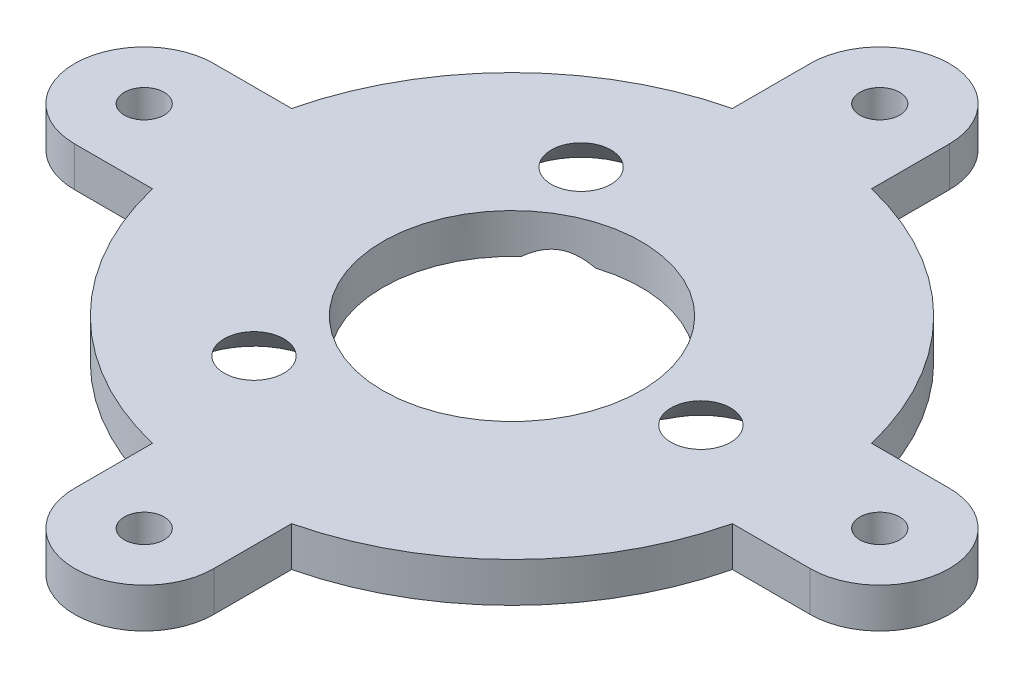
ISO-10303-21;
HEADER;
FILE_DESCRIPTION(('STEP AP214'),'2;1');
FILE_NAME('part.step','',(''),(''),'','','');
FILE_SCHEMA(('AUTOMOTIVE_DESIGN { 1 0 10303 214 1 1 1 1 }'));
ENDSEC;
DATA;
#1=APPLICATION_CONTEXT('core data for automotive mechanical design processes');
#2=APPLICATION_PROTOCOL_DEFINITION('international standard','automotive_design',2000,#1);
#3=PRODUCT_CONTEXT('',#1,'mechanical');
#4=PRODUCT('Part','Part','',(#3));
#5=PRODUCT_RELATED_PRODUCT_CATEGORY('part','',(#4));
#6=PRODUCT_DEFINITION_FORMATION('','',#4);
#7=PRODUCT_DEFINITION_CONTEXT('part definition',#1,'design');
#8=PRODUCT_DEFINITION('design','',#6,#7);
#9=PRODUCT_DEFINITION_SHAPE('','',#8);
#10=(LENGTH_UNIT() NAMED_UNIT(*) SI_UNIT(.MILLI.,.METRE.));
#11=(NAMED_UNIT(*) PLANE_ANGLE_UNIT() SI_UNIT($,.RADIAN.));
#12=(NAMED_UNIT(*) SI_UNIT($,.STERADIAN.) SOLID_ANGLE_UNIT());
#13=UNCERTAINTY_MEASURE_WITH_UNIT(LENGTH_MEASURE(1.E-05),#10,'distance_accuracy_value','');
#14=(GEOMETRIC_REPRESENTATION_CONTEXT(3) GLOBAL_UNCERTAINTY_ASSIGNED_CONTEXT((#13)) GLOBAL_UNIT_ASSIGNED_CONTEXT((#10,
#11,#12)) REPRESENTATION_CONTEXT('',''));
#15=CARTESIAN_POINT('',(0.,0.,0.));
#16=DIRECTION('',(0.,0.,1.));
#17=DIRECTION('',(1.,0.,0.));
#18=AXIS2_PLACEMENT_3D('',#15,#16,#17);
#19=CARTESIAN_POINT('',(0.,2.,0.));
#20=DIRECTION('',(0.,-1.,0.));
#21=DIRECTION('',(0.,0.,-1.));
#22=AXIS2_PLACEMENT_3D('',#19,#20,#21);
#23=CYLINDRICAL_SURFACE('',#22,15.);
#24=DIRECTION('',(0.,-1.,0.));
#25=VECTOR('',#24,1.);
#26=CARTESIAN_POINT('',(3.49999999999882,2.,14.5859521458136));
#27=LINE('',#26,#25);
#28=CARTESIAN_POINT('',(3.49999999999915,2.,14.585952145815));
#29=VERTEX_POINT('',#28);
#30=CARTESIAN_POINT('',(3.49999999999882,0.,14.5859521458136));
#31=VERTEX_POINT('',#30);
#32=EDGE_CURVE('E188',#29,#31,#27,.T.);
#33=ORIENTED_EDGE('',*,*,#32,.T.);
#34=CARTESIAN_POINT('',(0.,0.,0.));
#35=DIRECTION('',(0.,1.,0.));
#36=DIRECTION('',(0.,0.,1.));
#37=AXIS2_PLACEMENT_3D('',#34,#35,#36);
#38=CIRCLE('',#37,15.);
#39=CARTESIAN_POINT('',(14.5859521458148,0.,3.5));
#40=VERTEX_POINT('',#39);
#41=EDGE_CURVE('E381',#31,#40,#38,.T.);
#42=ORIENTED_EDGE('',*,*,#41,.T.);
#43=DIRECTION('',(0.,-1.,0.));
#44=VECTOR('',#43,1.);
#45=CARTESIAN_POINT('',(14.5859521458125,2.,3.5));
#46=LINE('',#45,#44);
#47=CARTESIAN_POINT('',(14.5859521458148,2.,3.5));
#48=VERTEX_POINT('',#47);
#49=EDGE_CURVE('E247',#48,#40,#46,.T.);
#50=ORIENTED_EDGE('',*,*,#49,.F.);
#51=CARTESIAN_POINT('',(0.,2.,0.));
#52=DIRECTION('',(0.,1.,0.));
#53=DIRECTION('',(0.,0.,1.));
#54=AXIS2_PLACEMENT_3D('',#51,#52,#53);
#55=CIRCLE('',#54,15.);
#56=EDGE_CURVE('E65',#29,#48,#55,.T.);
#57=ORIENTED_EDGE('',*,*,#56,.F.);
#58=EDGE_LOOP('',(#33,#42,#50,#57));
#59=FACE_BOUND('',#58,.T.);
#60=ADVANCED_FACE('F41',(#59),#23,.T.);
#61=DIRECTION('',(0.,-1.,0.));
#62=VECTOR('',#61,1.);
#63=CARTESIAN_POINT('',(-3.50000000000118,2.,14.5859521458136));
#64=LINE('',#63,#62);
#65=CARTESIAN_POINT('',(-3.50000000000118,2.,14.5859521458145));
#66=VERTEX_POINT('',#65);
#67=CARTESIAN_POINT('',(-3.50000000000118,0.,14.5859521458145));
#68=VERTEX_POINT('',#67);
#69=EDGE_CURVE('E73',#66,#68,#64,.T.);
#70=ORIENTED_EDGE('',*,*,#69,.F.);
#71=CARTESIAN_POINT('',(-14.5859521458148,2.,3.5));
#72=VERTEX_POINT('',#71);
#73=EDGE_CURVE('E373',#72,#66,#55,.T.);
#74=ORIENTED_EDGE('',*,*,#73,.F.);
#75=DIRECTION('',(0.,-1.,0.));
#76=VECTOR('',#75,1.);
#77=CARTESIAN_POINT('',(-14.5859521458148,2.,3.5));
#78=LINE('',#77,#76);
#79=CARTESIAN_POINT('',(-14.5859521458148,0.,3.5));
#80=VERTEX_POINT('',#79);
#81=EDGE_CURVE('E343',#72,#80,#78,.T.);
#82=ORIENTED_EDGE('',*,*,#81,.T.);
#83=EDGE_CURVE('E378',#80,#68,#38,.T.);
#84=ORIENTED_EDGE('',*,*,#83,.T.);
#85=EDGE_LOOP('',(#70,#74,#82,#84));
#86=FACE_BOUND('',#85,.T.);
#87=ADVANCED_FACE('F444',(#86),#23,.T.);
#88=DIRECTION('',(0.,-1.,0.));
#89=VECTOR('',#88,1.);
#90=CARTESIAN_POINT('',(14.5859521458125,2.,-3.5));
#91=LINE('',#90,#89);
#92=CARTESIAN_POINT('',(14.5859521458147,2.,-3.50000000000054));
#93=VERTEX_POINT('',#92);
#94=CARTESIAN_POINT('',(14.5859521458125,0.,-3.5));
#95=VERTEX_POINT('',#94);
#96=EDGE_CURVE('E251',#93,#95,#91,.T.);
#97=ORIENTED_EDGE('',*,*,#96,.T.);
#98=CARTESIAN_POINT('',(3.49999999999881,0.,-14.5859521458151));
#99=VERTEX_POINT('',#98);
#100=EDGE_CURVE('E481',#95,#99,#38,.T.);
#101=ORIENTED_EDGE('',*,*,#100,.T.);
#102=DIRECTION('',(0.,-1.,0.));
#103=VECTOR('',#102,1.);
#104=CARTESIAN_POINT('',(3.49999999999881,2.,-14.5859521458136));
#105=LINE('',#104,#103);
#106=CARTESIAN_POINT('',(3.49999999999881,2.,-14.5859521458151));
#107=VERTEX_POINT('',#106);
#108=EDGE_CURVE('E293',#107,#99,#105,.T.);
#109=ORIENTED_EDGE('',*,*,#108,.F.);
#110=EDGE_CURVE('E488',#93,#107,#55,.T.);
#111=ORIENTED_EDGE('',*,*,#110,.F.);
#112=EDGE_LOOP('',(#97,#101,#109,#111));
#113=FACE_BOUND('',#112,.T.);
#114=ADVANCED_FACE('F423',(#113),#23,.T.);
#115=DIRECTION('',(0.,-1.,0.));
#116=VECTOR('',#115,1.);
#117=CARTESIAN_POINT('',(-3.50000000000119,2.,-14.5859521458136));
#118=LINE('',#117,#116);
#119=CARTESIAN_POINT('',(-3.50000000000139,2.,-14.5859521458145));
#120=VERTEX_POINT('',#119);
#121=CARTESIAN_POINT('',(-3.50000000000119,0.,-14.5859521458136));
#122=VERTEX_POINT('',#121);
#123=EDGE_CURVE('E297',#120,#122,#118,.T.);
#124=ORIENTED_EDGE('',*,*,#123,.T.);
#125=CARTESIAN_POINT('',(-14.5859521458148,0.,-3.49999999999999));
#126=VERTEX_POINT('',#125);
#127=EDGE_CURVE('E367',#122,#126,#38,.T.);
#128=ORIENTED_EDGE('',*,*,#127,.T.);
#129=DIRECTION('',(0.,-1.,0.));
#130=VECTOR('',#129,1.);
#131=CARTESIAN_POINT('',(-14.5859521458148,2.,-3.49999999999999));
#132=LINE('',#131,#130);
#133=CARTESIAN_POINT('',(-14.5859521458148,2.,-3.5));
#134=VERTEX_POINT('',#133);
#135=EDGE_CURVE('E339',#134,#126,#132,.T.);
#136=ORIENTED_EDGE('',*,*,#135,.F.);
#137=EDGE_CURVE('E377',#120,#134,#55,.T.);
#138=ORIENTED_EDGE('',*,*,#137,.F.);
#139=EDGE_LOOP('',(#124,#128,#136,#138));
#140=FACE_BOUND('',#139,.T.);
#141=ADVANCED_FACE('F417',(#140),#23,.T.);
#142=CARTESIAN_POINT('',(0.,2.,0.));
#143=DIRECTION('',(0.,1.,0.));
#144=DIRECTION('',(0.,0.,1.));
#145=AXIS2_PLACEMENT_3D('',#142,#143,#144);
#146=PLANE('',#145);
#147=CARTESIAN_POINT('',(-4.75000000000004,2.,8.22724133595215));
#148=DIRECTION('',(0.,1.,0.));
#149=DIRECTION('',(0.,0.,1.));
#150=AXIS2_PLACEMENT_3D('',#147,#148,#149);
#151=CIRCLE('',#150,1.5);
#152=CARTESIAN_POINT('',(-4.75000000000004,2.,9.72724133595215));
#153=VERTEX_POINT('',#152);
#154=EDGE_CURVE('E354',#153,#153,#151,.T.);
#155=ORIENTED_EDGE('',*,*,#154,.F.);
#156=EDGE_LOOP('',(#155));
#157=FACE_BOUND('',#156,.T.);
#158=CARTESIAN_POINT('',(0.,2.,0.));
#159=DIRECTION('',(0.,1.,0.));
#160=DIRECTION('',(0.,0.,1.));
#161=AXIS2_PLACEMENT_3D('',#158,#159,#160);
#162=CIRCLE('',#161,6.5);
#163=CARTESIAN_POINT('',(0.,2.,6.5));
#164=VERTEX_POINT('',#163);
#165=EDGE_CURVE('E363',#164,#164,#162,.T.);
#166=ORIENTED_EDGE('',*,*,#165,.F.);
#167=EDGE_LOOP('',(#166));
#168=FACE_BOUND('',#167,.T.);
#169=ORIENTED_EDGE('',*,*,#73,.T.);
#170=DIRECTION('',(0.,0.,1.));
#171=VECTOR('',#170,1.);
#172=CARTESIAN_POINT('',(-3.50000000000118,2.,18.4999999999988));
#173=LINE('',#172,#171);
#174=CARTESIAN_POINT('',(-3.50000000000118,2.,18.4999999999988));
#175=VERTEX_POINT('',#174);
#176=EDGE_CURVE('E191',#66,#175,#173,.T.);
#177=ORIENTED_EDGE('',*,*,#176,.T.);
#178=CARTESIAN_POINT('',(-1.18141773922453E-12,2.,18.4999999999988));
#179=DIRECTION('',(0.,1.,0.));
#180=DIRECTION('',(0.,0.,1.));
#181=AXIS2_PLACEMENT_3D('',#178,#179,#180);
#182=CIRCLE('',#181,3.5);
#183=CARTESIAN_POINT('',(3.49999999999882,2.,18.4999999999988));
#184=VERTEX_POINT('',#183);
#185=EDGE_CURVE('E192',#175,#184,#182,.T.);
#186=ORIENTED_EDGE('',*,*,#185,.T.);
#187=DIRECTION('',(0.,0.,-1.));
#188=VECTOR('',#187,1.);
#189=CARTESIAN_POINT('',(3.49999999999882,2.,18.4999999999988));
#190=LINE('',#189,#188);
#191=EDGE_CURVE('E181',#184,#29,#190,.T.);
#192=ORIENTED_EDGE('',*,*,#191,.T.);
#193=ORIENTED_EDGE('',*,*,#56,.T.);
#194=DIRECTION('',(1.,0.,0.));
#195=VECTOR('',#194,1.);
#196=CARTESIAN_POINT('',(18.4999999999977,2.,3.5));
#197=LINE('',#196,#195);
#198=CARTESIAN_POINT('',(18.4999999999977,2.,3.5));
#199=VERTEX_POINT('',#198);
#200=EDGE_CURVE('E231',#48,#199,#197,.T.);
#201=ORIENTED_EDGE('',*,*,#200,.T.);
#202=CARTESIAN_POINT('',(18.4999999999977,2.,0.));
#203=DIRECTION('',(0.,1.,0.));
#204=DIRECTION('',(0.,0.,1.));
#205=AXIS2_PLACEMENT_3D('',#202,#203,#204);
#206=CIRCLE('',#205,3.5);
#207=CARTESIAN_POINT('',(18.4999999999977,2.,-3.5));
#208=VERTEX_POINT('',#207);
#209=EDGE_CURVE('E222',#199,#208,#206,.T.);
#210=ORIENTED_EDGE('',*,*,#209,.T.);
#211=DIRECTION('',(-1.,0.,0.));
#212=VECTOR('',#211,1.);
#213=CARTESIAN_POINT('',(18.4999999999977,2.,-3.5));
#214=LINE('',#213,#212);
#215=EDGE_CURVE('E226',#208,#93,#214,.T.);
#216=ORIENTED_EDGE('',*,*,#215,.T.);
#217=ORIENTED_EDGE('',*,*,#110,.T.);
#218=DIRECTION('',(0.,0.,-1.));
#219=VECTOR('',#218,1.);
#220=CARTESIAN_POINT('',(3.49999999999881,2.,-18.4999999999988));
#221=LINE('',#220,#219);
#222=CARTESIAN_POINT('',(3.49999999999881,2.,-18.4999999999988));
#223=VERTEX_POINT('',#222);
#224=EDGE_CURVE('E277',#107,#223,#221,.T.);
#225=ORIENTED_EDGE('',*,*,#224,.T.);
#226=CARTESIAN_POINT('',(-1.18594893238137E-12,2.,-18.4999999999988));
#227=DIRECTION('',(0.,1.,0.));
#228=DIRECTION('',(0.,0.,1.));
#229=AXIS2_PLACEMENT_3D('',#226,#227,#228);
#230=CIRCLE('',#229,3.5);
#231=CARTESIAN_POINT('',(-3.50000000000119,2.,-18.4999999999988));
#232=VERTEX_POINT('',#231);
#233=EDGE_CURVE('E268',#223,#232,#230,.T.);
#234=ORIENTED_EDGE('',*,*,#233,.T.);
#235=DIRECTION('',(0.,0.,1.));
#236=VECTOR('',#235,1.);
#237=CARTESIAN_POINT('',(-3.50000000000119,2.,-18.4999999999988));
#238=LINE('',#237,#236);
#239=EDGE_CURVE('E272',#232,#120,#238,.T.);
#240=ORIENTED_EDGE('',*,*,#239,.T.);
#241=ORIENTED_EDGE('',*,*,#137,.T.);
#242=DIRECTION('',(-1.,0.,0.));
#243=VECTOR('',#242,1.);
#244=CARTESIAN_POINT('',(-18.5,2.,-3.5));
#245=LINE('',#244,#243);
#246=CARTESIAN_POINT('',(-18.5,2.,-3.5));
#247=VERTEX_POINT('',#246);
#248=EDGE_CURVE('E323',#134,#247,#245,.T.);
#249=ORIENTED_EDGE('',*,*,#248,.T.);
#250=CARTESIAN_POINT('',(-18.5,2.,0.));
#251=DIRECTION('',(0.,1.,0.));
#252=DIRECTION('',(0.,0.,1.));
#253=AXIS2_PLACEMENT_3D('',#250,#251,#252);
#254=CIRCLE('',#253,3.5);
#255=CARTESIAN_POINT('',(-18.5,2.,3.5));
#256=VERTEX_POINT('',#255);
#257=EDGE_CURVE('E314',#247,#256,#254,.T.);
#258=ORIENTED_EDGE('',*,*,#257,.T.);
#259=DIRECTION('',(1.,0.,0.));
#260=VECTOR('',#259,1.);
#261=CARTESIAN_POINT('',(-18.5,2.,3.5));
#262=LINE('',#261,#260);
#263=EDGE_CURVE('E318',#256,#72,#262,.T.);
#264=ORIENTED_EDGE('',*,*,#263,.T.);
#265=EDGE_LOOP('',(#169,#177,#186,#192,#193,#201,#210,#216,#217,#225,#234,#240,#241,#249,#258,#264));
#266=FACE_BOUND('',#265,.T.);
#267=CARTESIAN_POINT('',(9.5,2.,0.));
#268=DIRECTION('',(0.,1.,0.));
#269=DIRECTION('',(0.,0.,1.));
#270=AXIS2_PLACEMENT_3D('',#267,#268,#269);
#271=CIRCLE('',#270,1.5);
#272=CARTESIAN_POINT('',(9.5,2.,1.5));
#273=VERTEX_POINT('',#272);
#274=EDGE_CURVE('E358',#273,#273,#271,.T.);
#275=ORIENTED_EDGE('',*,*,#274,.F.);
#276=EDGE_LOOP('',(#275));
#277=FACE_BOUND('',#276,.T.);
#278=CARTESIAN_POINT('',(-4.74999999999992,2.,-8.22724133595221));
#279=DIRECTION('',(0.,1.,0.));
#280=DIRECTION('',(0.,0.,1.));
#281=AXIS2_PLACEMENT_3D('',#278,#279,#280);
#282=CIRCLE('',#281,1.5);
#283=CARTESIAN_POINT('',(-4.74999999999992,2.,-6.72724133595221));
#284=VERTEX_POINT('',#283);
#285=EDGE_CURVE('E350',#284,#284,#282,.T.);
#286=ORIENTED_EDGE('',*,*,#285,.F.);
#287=EDGE_LOOP('',(#286));
#288=FACE_BOUND('',#287,.T.);
#289=CARTESIAN_POINT('',(-18.5,2.,0.));
#290=DIRECTION('',(0.,1.,0.));
#291=DIRECTION('',(0.,0.,1.));
#292=AXIS2_PLACEMENT_3D('',#289,#290,#291);
#293=CIRCLE('',#292,1.);
#294=CARTESIAN_POINT('',(-18.5,2.,1.));
#295=VERTEX_POINT('',#294);
#296=EDGE_CURVE('E306',#295,#295,#293,.T.);
#297=ORIENTED_EDGE('',*,*,#296,.F.);
#298=EDGE_LOOP('',(#297));
#299=FACE_BOUND('',#298,.T.);
#300=CARTESIAN_POINT('',(-1.18594893238137E-12,2.,-18.4999999999988));
#301=DIRECTION('',(0.,1.,0.));
#302=DIRECTION('',(0.,0.,1.));
#303=AXIS2_PLACEMENT_3D('',#300,#301,#302);
#304=CIRCLE('',#303,1.);
#305=CARTESIAN_POINT('',(-1.18594893238137E-12,2.,-17.4999999999988));
#306=VERTEX_POINT('',#305);
#307=EDGE_CURVE('E260',#306,#306,#304,.T.);
#308=ORIENTED_EDGE('',*,*,#307,.F.);
#309=EDGE_LOOP('',(#308));
#310=FACE_BOUND('',#309,.T.);
#311=CARTESIAN_POINT('',(18.4999999999977,2.,0.));
#312=DIRECTION('',(0.,1.,0.));
#313=DIRECTION('',(0.,0.,1.));
#314=AXIS2_PLACEMENT_3D('',#311,#312,#313);
#315=CIRCLE('',#314,1.);
#316=CARTESIAN_POINT('',(18.4999999999977,2.,0.999999999999999));
#317=VERTEX_POINT('',#316);
#318=EDGE_CURVE('E213',#317,#317,#315,.T.);
#319=ORIENTED_EDGE('',*,*,#318,.F.);
#320=EDGE_LOOP('',(#319));
#321=FACE_BOUND('',#320,.T.);
#322=CARTESIAN_POINT('',(-1.18141773922453E-12,2.,18.4999999999988));
#323=DIRECTION('',(0.,1.,0.));
#324=DIRECTION('',(0.,0.,1.));
#325=AXIS2_PLACEMENT_3D('',#322,#323,#324);
#326=CIRCLE('',#325,1.);
#327=CARTESIAN_POINT('',(-1.18141773922453E-12,2.,19.4999999999988));
#328=VERTEX_POINT('',#327);
#329=EDGE_CURVE('E454',#328,#328,#326,.T.);
#330=ORIENTED_EDGE('',*,*,#329,.F.);
#331=EDGE_LOOP('',(#330));
#332=FACE_BOUND('',#331,.T.);
#333=ADVANCED_FACE('F195',(#157,#168,#266,#277,#288,#299,#310,#321,#332),#146,.T.);
#334=CARTESIAN_POINT('',(0.,0.,0.));
#335=DIRECTION('',(0.,1.,0.));
#336=DIRECTION('',(0.,0.,1.));
#337=AXIS2_PLACEMENT_3D('',#334,#335,#336);
#338=PLANE('',#337);
#339=ORIENTED_EDGE('',*,*,#83,.F.);
#340=DIRECTION('',(1.,0.,0.));
#341=VECTOR('',#340,1.);
#342=CARTESIAN_POINT('',(-18.5,0.,3.5));
#343=LINE('',#342,#341);
#344=CARTESIAN_POINT('',(-18.5,0.,3.5));
#345=VERTEX_POINT('',#344);
#346=EDGE_CURVE('E330',#345,#80,#343,.T.);
#347=ORIENTED_EDGE('',*,*,#346,.F.);
#348=CARTESIAN_POINT('',(-18.5,0.,0.));
#349=DIRECTION('',(0.,1.,0.));
#350=DIRECTION('',(0.,0.,1.));
#351=AXIS2_PLACEMENT_3D('',#348,#349,#350);
#352=CIRCLE('',#351,3.5);
#353=CARTESIAN_POINT('',(-18.5,0.,-3.5));
#354=VERTEX_POINT('',#353);
#355=EDGE_CURVE('E310',#354,#345,#352,.T.);
#356=ORIENTED_EDGE('',*,*,#355,.F.);
#357=DIRECTION('',(-1.,0.,0.));
#358=VECTOR('',#357,1.);
#359=CARTESIAN_POINT('',(-18.5,0.,-3.5));
#360=LINE('',#359,#358);
#361=EDGE_CURVE('E319',#126,#354,#360,.T.);
#362=ORIENTED_EDGE('',*,*,#361,.F.);
#363=ORIENTED_EDGE('',*,*,#127,.F.);
#364=DIRECTION('',(0.,0.,1.));
#365=VECTOR('',#364,1.);
#366=CARTESIAN_POINT('',(-3.50000000000119,0.,-18.4999999999988));
#367=LINE('',#366,#365);
#368=CARTESIAN_POINT('',(-3.50000000000119,0.,-18.4999999999988));
#369=VERTEX_POINT('',#368);
#370=EDGE_CURVE('E284',#369,#122,#367,.T.);
#371=ORIENTED_EDGE('',*,*,#370,.F.);
#372=CARTESIAN_POINT('',(-1.18594893238137E-12,0.,-18.4999999999988));
#373=DIRECTION('',(0.,1.,0.));
#374=DIRECTION('',(0.,0.,1.));
#375=AXIS2_PLACEMENT_3D('',#372,#373,#374);
#376=CIRCLE('',#375,3.5);
#377=CARTESIAN_POINT('',(3.49999999999881,0.,-18.4999999999988));
#378=VERTEX_POINT('',#377);
#379=EDGE_CURVE('E264',#378,#369,#376,.T.);
#380=ORIENTED_EDGE('',*,*,#379,.F.);
#381=DIRECTION('',(0.,0.,-1.));
#382=VECTOR('',#381,1.);
#383=CARTESIAN_POINT('',(3.49999999999881,0.,-18.4999999999988));
#384=LINE('',#383,#382);
#385=EDGE_CURVE('E273',#99,#378,#384,.T.);
#386=ORIENTED_EDGE('',*,*,#385,.F.);
#387=ORIENTED_EDGE('',*,*,#100,.F.);
#388=DIRECTION('',(-1.,0.,0.));
#389=VECTOR('',#388,1.);
#390=CARTESIAN_POINT('',(18.4999999999977,0.,-3.5));
#391=LINE('',#390,#389);
#392=CARTESIAN_POINT('',(18.4999999999977,0.,-3.5));
#393=VERTEX_POINT('',#392);
#394=EDGE_CURVE('E238',#393,#95,#391,.T.);
#395=ORIENTED_EDGE('',*,*,#394,.F.);
#396=CARTESIAN_POINT('',(18.4999999999977,0.,0.));
#397=DIRECTION('',(0.,1.,0.));
#398=DIRECTION('',(0.,0.,1.));
#399=AXIS2_PLACEMENT_3D('',#396,#397,#398);
#400=CIRCLE('',#399,3.5);
#401=CARTESIAN_POINT('',(18.4999999999977,0.,3.5));
#402=VERTEX_POINT('',#401);
#403=EDGE_CURVE('E220',#402,#393,#400,.T.);
#404=ORIENTED_EDGE('',*,*,#403,.F.);
#405=DIRECTION('',(1.,0.,0.));
#406=VECTOR('',#405,1.);
#407=CARTESIAN_POINT('',(18.4999999999977,0.,3.5));
#408=LINE('',#407,#406);
#409=EDGE_CURVE('E227',#40,#402,#408,.T.);
#410=ORIENTED_EDGE('',*,*,#409,.F.);
#411=ORIENTED_EDGE('',*,*,#41,.F.);
#412=DIRECTION('',(0.,0.,-1.));
#413=VECTOR('',#412,1.);
#414=CARTESIAN_POINT('',(3.49999999999882,0.,18.4999999999988));
#415=LINE('',#414,#413);
#416=CARTESIAN_POINT('',(3.49999999999882,0.,18.4999999999988));
#417=VERTEX_POINT('',#416);
#418=EDGE_CURVE('E448',#417,#31,#415,.T.);
#419=ORIENTED_EDGE('',*,*,#418,.F.);
#420=CARTESIAN_POINT('',(-1.18141773922453E-12,0.,18.4999999999988));
#421=DIRECTION('',(0.,1.,0.));
#422=DIRECTION('',(0.,0.,1.));
#423=AXIS2_PLACEMENT_3D('',#420,#421,#422);
#424=CIRCLE('',#423,3.5);
#425=CARTESIAN_POINT('',(-3.50000000000118,0.,18.4999999999988));
#426=VERTEX_POINT('',#425);
#427=EDGE_CURVE('E206',#426,#417,#424,.T.);
#428=ORIENTED_EDGE('',*,*,#427,.F.);
#429=DIRECTION('',(0.,0.,1.));
#430=VECTOR('',#429,1.);
#431=CARTESIAN_POINT('',(-3.50000000000118,0.,18.4999999999988));
#432=LINE('',#431,#430);
#433=EDGE_CURVE('E202',#68,#426,#432,.T.);
#434=ORIENTED_EDGE('',*,*,#433,.F.);
#435=EDGE_LOOP('',(#339,#347,#356,#362,#363,#371,#380,#386,#387,#395,#404,#410,#411,#419,#428,#434));
#436=FACE_BOUND('',#435,.T.);
#437=CARTESIAN_POINT('',(0.,0.,0.));
#438=DIRECTION('',(0.,1.,0.));
#439=DIRECTION('',(0.,0.,1.));
#440=AXIS2_PLACEMENT_3D('',#437,#438,#439);
#441=CIRCLE('',#440,6.5);
#442=CARTESIAN_POINT('',(-1.99052981844675,0.,6.18771290881165));
#443=VERTEX_POINT('',#442);
#444=CARTESIAN_POINT('',(6.35398147957916,0.,1.37000706464055));
#445=VERTEX_POINT('',#444);
#446=EDGE_CURVE('E362',#443,#445,#441,.T.);
#447=ORIENTED_EDGE('',*,*,#446,.T.);
#448=CARTESIAN_POINT('',(9.5,0.,0.));
#449=DIRECTION('',(0.,1.,0.));
#450=DIRECTION('',(0.,0.,1.));
#451=AXIS2_PLACEMENT_3D('',#448,#449,#450);
#452=CIRCLE('',#451,3.43137754961414);
#453=CARTESIAN_POINT('',(6.35398147957916,0.,-1.37000706464055));
#454=VERTEX_POINT('',#453);
#455=EDGE_CURVE('E389',#445,#454,#452,.T.);
#456=ORIENTED_EDGE('',*,*,#455,.T.);
#457=CARTESIAN_POINT('',(-1.99052981844665,0.,-6.18771290881168));
#458=VERTEX_POINT('',#457);
#459=EDGE_CURVE('E368',#454,#458,#441,.T.);
#460=ORIENTED_EDGE('',*,*,#459,.T.);
#461=CARTESIAN_POINT('',(-4.74999999999992,0.,-8.22724133595221));
#462=DIRECTION('',(0.,1.,0.));
#463=DIRECTION('',(0.,0.,1.));
#464=AXIS2_PLACEMENT_3D('',#461,#462,#463);
#465=CIRCLE('',#464,3.43137754961414);
#466=CARTESIAN_POINT('',(-4.36345166113241,0.,-4.81770584417115));
#467=VERTEX_POINT('',#466);
#468=EDGE_CURVE('E376',#458,#467,#465,.T.);
#469=ORIENTED_EDGE('',*,*,#468,.T.);
#470=CARTESIAN_POINT('',(-4.36345166113247,0.,4.8177058441711));
#471=VERTEX_POINT('',#470);
#472=EDGE_CURVE('E372',#467,#471,#441,.T.);
#473=ORIENTED_EDGE('',*,*,#472,.T.);
#474=CARTESIAN_POINT('',(-4.75000000000004,0.,8.22724133595215));
#475=DIRECTION('',(0.,1.,0.));
#476=DIRECTION('',(0.,0.,1.));
#477=AXIS2_PLACEMENT_3D('',#474,#475,#476);
#478=CIRCLE('',#477,3.43137754961414);
#479=EDGE_CURVE('E385',#471,#443,#478,.T.);
#480=ORIENTED_EDGE('',*,*,#479,.T.);
#481=EDGE_LOOP('',(#447,#456,#460,#469,#473,#480));
#482=FACE_BOUND('',#481,.T.);
#483=CARTESIAN_POINT('',(-18.5,0.,0.));
#484=DIRECTION('',(0.,1.,0.));
#485=DIRECTION('',(0.,0.,1.));
#486=AXIS2_PLACEMENT_3D('',#483,#484,#485);
#487=CIRCLE('',#486,1.);
#488=CARTESIAN_POINT('',(-18.5,0.,1.));
#489=VERTEX_POINT('',#488);
#490=EDGE_CURVE('E305',#489,#489,#487,.T.);
#491=ORIENTED_EDGE('',*,*,#490,.T.);
#492=EDGE_LOOP('',(#491));
#493=FACE_BOUND('',#492,.T.);
#494=CARTESIAN_POINT('',(-1.18594893238137E-12,0.,-18.4999999999988));
#495=DIRECTION('',(0.,1.,0.));
#496=DIRECTION('',(0.,0.,1.));
#497=AXIS2_PLACEMENT_3D('',#494,#495,#496);
#498=CIRCLE('',#497,1.);
#499=CARTESIAN_POINT('',(-1.18594893238137E-12,0.,-17.4999999999988));
#500=VERTEX_POINT('',#499);
#501=EDGE_CURVE('E259',#500,#500,#498,.T.);
#502=ORIENTED_EDGE('',*,*,#501,.T.);
#503=EDGE_LOOP('',(#502));
#504=FACE_BOUND('',#503,.T.);
#505=CARTESIAN_POINT('',(18.4999999999977,0.,0.));
#506=DIRECTION('',(0.,1.,0.));
#507=DIRECTION('',(0.,0.,1.));
#508=AXIS2_PLACEMENT_3D('',#505,#506,#507);
#509=CIRCLE('',#508,1.);
#510=CARTESIAN_POINT('',(18.4999999999977,0.,0.999999999999999));
#511=VERTEX_POINT('',#510);
#512=EDGE_CURVE('E208',#511,#511,#509,.T.);
#513=ORIENTED_EDGE('',*,*,#512,.T.);
#514=EDGE_LOOP('',(#513));
#515=FACE_BOUND('',#514,.T.);
#516=CARTESIAN_POINT('',(-1.18141773922453E-12,0.,18.4999999999988));
#517=DIRECTION('',(0.,1.,0.));
#518=DIRECTION('',(0.,0.,1.));
#519=AXIS2_PLACEMENT_3D('',#516,#517,#518);
#520=CIRCLE('',#519,1.);
#521=CARTESIAN_POINT('',(-1.18141773922453E-12,0.,19.4999999999988));
#522=VERTEX_POINT('',#521);
#523=EDGE_CURVE('E513',#522,#522,#520,.T.);
#524=ORIENTED_EDGE('',*,*,#523,.T.);
#525=EDGE_LOOP('',(#524));
#526=FACE_BOUND('',#525,.T.);
#527=ADVANCED_FACE('F409',(#436,#482,#493,#504,#515,#526),#338,.F.);
#528=CARTESIAN_POINT('',(0.,2.,0.));
#529=DIRECTION('',(0.,-1.,0.));
#530=DIRECTION('',(0.,0.,-1.));
#531=AXIS2_PLACEMENT_3D('',#528,#529,#530);
#532=CYLINDRICAL_SURFACE('',#531,6.5);
#533=ORIENTED_EDGE('',*,*,#165,.T.);
#534=EDGE_LOOP('',(#533));
#535=FACE_BOUND('',#534,.T.);
#536=ORIENTED_EDGE('',*,*,#459,.F.);
#537=CARTESIAN_POINT('',(6.35398147957916,0.,-1.37000706464055));
#538=CARTESIAN_POINT('',(6.36933277695899,0.0439905733202852,-1.29877678597558));
#539=CARTESIAN_POINT('',(6.38375179969553,0.0861673998208572,-1.22611798559287));
#540=CARTESIAN_POINT('',(6.41053166318999,0.165773816872423,-1.07742516951851));
#541=CARTESIAN_POINT('',(6.42288206704704,0.20317912014279,-1.0013763530195));
#542=CARTESIAN_POINT('',(6.44527943488262,0.2719850648157,-0.845355845341482));
#543=CARTESIAN_POINT('',(6.45530382164283,0.303326397442257,-0.765354162805089));
#544=CARTESIAN_POINT('',(6.47255014470055,0.357843258852706,-0.602341643896573));
#545=CARTESIAN_POINT('',(6.47977368859836,0.381023471171434,-0.51933256368911));
#546=CARTESIAN_POINT('',(6.4927637424562,0.422970728528152,-0.32558569628593));
#547=CARTESIAN_POINT('',(6.49744535058935,0.438334967035942,-0.213991251155706));
#548=CARTESIAN_POINT('',(6.50094685074658,0.449804077632399,0.00953862040834799));
#549=CARTESIAN_POINT('',(6.49980674685576,0.44604038874273,0.121466451913322));
#550=CARTESIAN_POINT('',(6.49190948453391,0.420263817955133,0.342547872383482));
#551=CARTESIAN_POINT('',(6.48516934201585,0.398306219435174,0.451708834401524));
#552=CARTESIAN_POINT('',(6.46669524981636,0.339213852089589,0.665969295772846));
#553=CARTESIAN_POINT('',(6.4549308255903,0.301986520855526,0.77103966906551));
#554=CARTESIAN_POINT('',(6.4292553120726,0.222591793209186,0.960426832884736));
#555=CARTESIAN_POINT('',(6.41592541714601,0.181987402329585,1.04550294230978));
#556=CARTESIAN_POINT('',(6.38674835985652,0.0949379985065357,1.21094248388239));
#557=CARTESIAN_POINT('',(6.37093113901175,0.0485636761880788,1.29134810177757));
#558=CARTESIAN_POINT('',(6.35398147957916,0.,1.37000706464055));
#559=B_SPLINE_CURVE_WITH_KNOTS('',3,(#537,#538,#539,#540,#541,#542,#543,#544,#545,#546,#547,
#548,#549,#550,#551,#552,#553,#554,#555,#556,#557,#558),.UNSPECIFIED.,.F.,.F.,(4,2,2,2,2,2,2,2,
2,2,4),(0.,0.255443683969308,0.512139693329113,0.771231794349266,1.03017496330815,
1.36669696872574,1.70090967700549,2.03411056638772,2.36936183265089,2.65465121331866,
2.93673765183547),.UNSPECIFIED.);
#560=EDGE_CURVE('E11',#454,#445,#559,.T.);
#561=ORIENTED_EDGE('',*,*,#560,.T.);
#562=ORIENTED_EDGE('',*,*,#446,.F.);
#563=CARTESIAN_POINT('',(-1.99052981844675,0.,6.18771290881165));
#564=CARTESIAN_POINT('',(-2.05989269797917,0.0439905733202861,6.16539238299115));
#565=CARTESIAN_POINT('',(-2.13002657628737,0.0861673998208584,6.14155022278739));
#566=CARTESIAN_POINT('',(-2.27218826411524,0.165773816872424,6.09039585684628));
#567=CARTESIAN_POINT('',(-2.34422367305965,0.203179120142791,6.06306721208398));
#568=CARTESIAN_POINT('',(-2.49054008013795,0.2719850648157,6.00445364776848));
#569=CARTESIAN_POINT('',(-2.56483576294007,0.303326397442256,5.97313418009199));
#570=CARTESIAN_POINT('',(-2.7146319069786,0.357843258852704,5.90656367452759));
#571=CARTESIAN_POINT('',(-2.79013165113194,0.381023471171432,5.87131490694472));
#572=CARTESIAN_POINT('',(-2.96441638713567,0.42297072852815,5.78569118988055));
#573=CARTESIAN_POINT('',(-3.06340081560625,0.438334967035941,5.7339483588893));
#574=CARTESIAN_POINT('',(-3.25873411296401,0.449804077632397,5.62521581119479));
#575=CARTESIAN_POINT('',(-3.35509640649241,0.446040388742728,5.56826453650989));
#576=CARTESIAN_POINT('',(-3.54260990176339,0.420263817955129,5.45088459648374));
#577=CARTESIAN_POINT('',(-3.63377599671353,0.39830621943517,5.39046698082896));
#578=CARTESIAN_POINT('',(-3.81009395318793,0.339213852089586,5.26733771698668));
#579=CARTESIAN_POINT('',(-3.89520535353146,0.301986520855522,5.20461424009968));
#580=CARTESIAN_POINT('',(-4.04638169179074,0.222591793209183,5.08768501122853));
#581=CARTESIAN_POINT('',(-4.11339481634467,0.181987402329582,5.03360292887981));
#582=CARTESIAN_POINT('',(-4.24208113349225,0.0949379985065339,4.92561508527313));
#583=CARTESIAN_POINT('',(-4.30380583077408,0.0485636761880778,4.87171416125669));
#584=CARTESIAN_POINT('',(-4.36345166113247,0.,4.8177058441711));
#585=B_SPLINE_CURVE_WITH_KNOTS('',3,(#563,#564,#565,#566,#567,#568,#569,#570,#571,#572,#573,
#574,#575,#576,#577,#578,#579,#580,#581,#582,#583,#584),.UNSPECIFIED.,.F.,.F.,(4,2,2,2,2,2,2,2,
2,2,4),(0.,0.255443683969308,0.512139693329114,0.771231794349267,1.03017496330815,
1.36669696872574,1.70090967700549,2.03411056638773,2.36936183265089,2.65465121331866,
2.93673765183546),.UNSPECIFIED.);
#586=EDGE_CURVE('E58',#443,#471,#585,.T.);
#587=ORIENTED_EDGE('',*,*,#586,.T.);
#588=ORIENTED_EDGE('',*,*,#472,.F.);
#589=CARTESIAN_POINT('',(-4.36345166113241,0.,-4.81770584417115));
#590=CARTESIAN_POINT('',(-4.30944007897981,0.0439905733202844,-4.86661559701561));
#591=CARTESIAN_POINT('',(-4.25372522340815,0.0861673998208561,-4.91543223719456));
#592=CARTESIAN_POINT('',(-4.13834339907473,0.165773816872422,-5.01297068732782));
#593=CARTESIAN_POINT('',(-4.07865839398737,0.20317912014279,-5.06169085906453));
#594=CARTESIAN_POINT('',(-3.95473935474466,0.271985064815699,-5.15909780242705));
#595=CARTESIAN_POINT('',(-3.89046805870275,0.303326397442256,-5.20778001728695));
#596=CARTESIAN_POINT('',(-3.75791823772194,0.357843258852705,-5.30422203063106));
#597=CARTESIAN_POINT('',(-3.6896420374664,0.381023471171433,-5.35198234325565));
#598=CARTESIAN_POINT('',(-3.52834735532052,0.422970728528151,-5.46010549359466));
#599=CARTESIAN_POINT('',(-3.43404453498309,0.438334967035942,-5.51995710773364));
#600=CARTESIAN_POINT('',(-3.24221273778256,0.4498040776324,-5.63475443160318));
#601=CARTESIAN_POINT('',(-3.14471034036333,0.446040388742731,-5.68973098842326));
#602=CARTESIAN_POINT('',(-2.9492995827705,0.420263817955134,-5.79343246886727));
#603=CARTESIAN_POINT('',(-2.8513933453023,0.398306219435176,-5.84217581523052));
#604=CARTESIAN_POINT('',(-2.65660129662841,0.339213852089592,-5.93330701275957));
#605=CARTESIAN_POINT('',(-2.55972547205882,0.301986520855528,-5.97565390916524));
#606=CARTESIAN_POINT('',(-2.38287362028184,0.222591793209188,-6.04811184411331));
#607=CARTESIAN_POINT('',(-2.30253060080131,0.181987402329586,-6.07910587118963));
#608=CARTESIAN_POINT('',(-2.14466722636423,0.0949379985065351,-6.13655756915556));
#609=CARTESIAN_POINT('',(-2.06712530823762,0.0485636761880772,-6.16306226303431));
#610=CARTESIAN_POINT('',(-1.99052981844665,0.,-6.18771290881168));
#611=B_SPLINE_CURVE_WITH_KNOTS('',3,(#589,#590,#591,#592,#593,#594,#595,#596,#597,#598,#599,
#600,#601,#602,#603,#604,#605,#606,#607,#608,#609,#610),.UNSPECIFIED.,.F.,.F.,(4,2,2,2,2,2,2,2,
2,2,4),(0.,0.255443683969309,0.512139693329114,0.771231794349267,1.03017496330816,
1.36669696872575,1.70090967700549,2.03411056638773,2.36936183265089,2.65465121331867,
2.93673765183548),.UNSPECIFIED.);
#612=EDGE_CURVE('E393',#467,#458,#611,.T.);
#613=ORIENTED_EDGE('',*,*,#612,.T.);
#614=EDGE_LOOP('',(#536,#561,#562,#587,#588,#613));
#615=FACE_BOUND('',#614,.T.);
#616=ADVANCED_FACE('F403',(#535,#615),#532,.F.);
#617=CARTESIAN_POINT('',(9.5,0.,0.));
#618=DIRECTION('',(0.,-1.,0.));
#619=DIRECTION('',(0.,0.,-1.));
#620=AXIS2_PLACEMENT_3D('',#617,#618,#619);
#621=CONICAL_SURFACE('',#620,3.43137754961414,0.767944870877502);
#622=ORIENTED_EDGE('',*,*,#274,.T.);
#623=EDGE_LOOP('',(#622));
#624=FACE_BOUND('',#623,.T.);
#625=ORIENTED_EDGE('',*,*,#560,.F.);
#626=ORIENTED_EDGE('',*,*,#455,.F.);
#627=EDGE_LOOP('',(#625,#626));
#628=FACE_BOUND('',#627,.T.);
#629=ADVANCED_FACE('F408',(#624,#628),#621,.F.);
#630=CARTESIAN_POINT('',(-4.75000000000004,0.,8.22724133595215));
#631=DIRECTION('',(0.,-1.,0.));
#632=DIRECTION('',(0.,0.,-1.));
#633=AXIS2_PLACEMENT_3D('',#630,#631,#632);
#634=CONICAL_SURFACE('',#633,3.43137754961414,0.767944870877502);
#635=ORIENTED_EDGE('',*,*,#154,.T.);
#636=EDGE_LOOP('',(#635));
#637=FACE_BOUND('',#636,.T.);
#638=ORIENTED_EDGE('',*,*,#586,.F.);
#639=ORIENTED_EDGE('',*,*,#479,.F.);
#640=EDGE_LOOP('',(#638,#639));
#641=FACE_BOUND('',#640,.T.);
#642=ADVANCED_FACE('F431',(#637,#641),#634,.F.);
#643=CARTESIAN_POINT('',(-4.74999999999992,0.,-8.22724133595221));
#644=DIRECTION('',(0.,-1.,0.));
#645=DIRECTION('',(0.,0.,-1.));
#646=AXIS2_PLACEMENT_3D('',#643,#644,#645);
#647=CONICAL_SURFACE('',#646,3.43137754961414,0.767944870877502);
#648=ORIENTED_EDGE('',*,*,#285,.T.);
#649=EDGE_LOOP('',(#648));
#650=FACE_BOUND('',#649,.T.);
#651=ORIENTED_EDGE('',*,*,#612,.F.);
#652=ORIENTED_EDGE('',*,*,#468,.F.);
#653=EDGE_LOOP('',(#651,#652));
#654=FACE_BOUND('',#653,.T.);
#655=ADVANCED_FACE('F44',(#650,#654),#647,.F.);
#656=CARTESIAN_POINT('',(-18.5,2.,0.));
#657=DIRECTION('',(0.,-1.,0.));
#658=DIRECTION('',(0.,0.,-1.));
#659=AXIS2_PLACEMENT_3D('',#656,#657,#658);
#660=CYLINDRICAL_SURFACE('',#659,3.5);
#661=ORIENTED_EDGE('',*,*,#355,.T.);
#662=DIRECTION('',(0.,-1.,0.));
#663=VECTOR('',#662,1.);
#664=CARTESIAN_POINT('',(-18.5,2.,3.5));
#665=LINE('',#664,#663);
#666=EDGE_CURVE('E346',#256,#345,#665,.T.);
#667=ORIENTED_EDGE('',*,*,#666,.F.);
#668=ORIENTED_EDGE('',*,*,#257,.F.);
#669=DIRECTION('',(0.,-1.,0.));
#670=VECTOR('',#669,1.);
#671=CARTESIAN_POINT('',(-18.5,2.,-3.5));
#672=LINE('',#671,#670);
#673=EDGE_CURVE('E326',#247,#354,#672,.T.);
#674=ORIENTED_EDGE('',*,*,#673,.T.);
#675=EDGE_LOOP('',(#661,#667,#668,#674));
#676=FACE_BOUND('',#675,.T.);
#677=ADVANCED_FACE('F411',(#676),#660,.T.);
#678=CARTESIAN_POINT('',(-18.5,2.,3.5));
#679=DIRECTION('',(0.,0.,-1.));
#680=DIRECTION('',(-1.,0.,0.));
#681=AXIS2_PLACEMENT_3D('',#678,#679,#680);
#682=PLANE('',#681);
#683=ORIENTED_EDGE('',*,*,#346,.T.);
#684=ORIENTED_EDGE('',*,*,#81,.F.);
#685=ORIENTED_EDGE('',*,*,#263,.F.);
#686=ORIENTED_EDGE('',*,*,#666,.T.);
#687=EDGE_LOOP('',(#683,#684,#685,#686));
#688=FACE_BOUND('',#687,.T.);
#689=ADVANCED_FACE('F469',(#688),#682,.F.);
#690=CARTESIAN_POINT('',(-18.5,2.,-3.5));
#691=DIRECTION('',(0.,0.,1.));
#692=DIRECTION('',(1.,0.,0.));
#693=AXIS2_PLACEMENT_3D('',#690,#691,#692);
#694=PLANE('',#693);
#695=ORIENTED_EDGE('',*,*,#361,.T.);
#696=ORIENTED_EDGE('',*,*,#673,.F.);
#697=ORIENTED_EDGE('',*,*,#248,.F.);
#698=ORIENTED_EDGE('',*,*,#135,.T.);
#699=EDGE_LOOP('',(#695,#696,#697,#698));
#700=FACE_BOUND('',#699,.T.);
#701=ADVANCED_FACE('F476',(#700),#694,.F.);
#702=CARTESIAN_POINT('',(-18.5,2.,0.));
#703=DIRECTION('',(0.,-1.,0.));
#704=DIRECTION('',(0.,0.,-1.));
#705=AXIS2_PLACEMENT_3D('',#702,#703,#704);
#706=CYLINDRICAL_SURFACE('',#705,1.);
#707=ORIENTED_EDGE('',*,*,#296,.T.);
#708=EDGE_LOOP('',(#707));
#709=FACE_BOUND('',#708,.T.);
#710=ORIENTED_EDGE('',*,*,#490,.F.);
#711=EDGE_LOOP('',(#710));
#712=FACE_BOUND('',#711,.T.);
#713=ADVANCED_FACE('F567',(#709,#712),#706,.F.);
#714=CARTESIAN_POINT('',(-1.18594893238137E-12,2.,-18.4999999999988));
#715=DIRECTION('',(0.,-1.,0.));
#716=DIRECTION('',(0.,0.,-1.));
#717=AXIS2_PLACEMENT_3D('',#714,#715,#716);
#718=CYLINDRICAL_SURFACE('',#717,3.5);
#719=ORIENTED_EDGE('',*,*,#379,.T.);
#720=DIRECTION('',(0.,-1.,0.));
#721=VECTOR('',#720,1.);
#722=CARTESIAN_POINT('',(-3.50000000000119,2.,-18.4999999999988));
#723=LINE('',#722,#721);
#724=EDGE_CURVE('E301',#232,#369,#723,.T.);
#725=ORIENTED_EDGE('',*,*,#724,.F.);
#726=ORIENTED_EDGE('',*,*,#233,.F.);
#727=DIRECTION('',(0.,-1.,0.));
#728=VECTOR('',#727,1.);
#729=CARTESIAN_POINT('',(3.49999999999881,2.,-18.4999999999988));
#730=LINE('',#729,#728);
#731=EDGE_CURVE('E280',#223,#378,#730,.T.);
#732=ORIENTED_EDGE('',*,*,#731,.T.);
#733=EDGE_LOOP('',(#719,#725,#726,#732));
#734=FACE_BOUND('',#733,.T.);
#735=ADVANCED_FACE('F563',(#734),#718,.T.);
#736=CARTESIAN_POINT('',(-3.50000000000119,2.,-18.4999999999988));
#737=DIRECTION('',(1.,0.,0.));
#738=DIRECTION('',(0.,0.,-1.));
#739=AXIS2_PLACEMENT_3D('',#736,#737,#738);
#740=PLANE('',#739);
#741=ORIENTED_EDGE('',*,*,#370,.T.);
#742=ORIENTED_EDGE('',*,*,#123,.F.);
#743=ORIENTED_EDGE('',*,*,#239,.F.);
#744=ORIENTED_EDGE('',*,*,#724,.T.);
#745=EDGE_LOOP('',(#741,#742,#743,#744));
#746=FACE_BOUND('',#745,.T.);
#747=ADVANCED_FACE('F559',(#746),#740,.F.);
#748=CARTESIAN_POINT('',(3.49999999999881,2.,-18.4999999999988));
#749=DIRECTION('',(-1.,0.,0.));
#750=DIRECTION('',(0.,0.,1.));
#751=AXIS2_PLACEMENT_3D('',#748,#749,#750);
#752=PLANE('',#751);
#753=ORIENTED_EDGE('',*,*,#385,.T.);
#754=ORIENTED_EDGE('',*,*,#731,.F.);
#755=ORIENTED_EDGE('',*,*,#224,.F.);
#756=ORIENTED_EDGE('',*,*,#108,.T.);
#757=EDGE_LOOP('',(#753,#754,#755,#756));
#758=FACE_BOUND('',#757,.T.);
#759=ADVANCED_FACE('F555',(#758),#752,.F.);
#760=CARTESIAN_POINT('',(-1.18594893238137E-12,2.,-18.4999999999988));
#761=DIRECTION('',(0.,-1.,0.));
#762=DIRECTION('',(0.,0.,-1.));
#763=AXIS2_PLACEMENT_3D('',#760,#761,#762);
#764=CYLINDRICAL_SURFACE('',#763,1.);
#765=ORIENTED_EDGE('',*,*,#307,.T.);
#766=EDGE_LOOP('',(#765));
#767=FACE_BOUND('',#766,.T.);
#768=ORIENTED_EDGE('',*,*,#501,.F.);
#769=EDGE_LOOP('',(#768));
#770=FACE_BOUND('',#769,.T.);
#771=ADVANCED_FACE('F551',(#767,#770),#764,.F.);
#772=CARTESIAN_POINT('',(18.4999999999977,2.,0.));
#773=DIRECTION('',(0.,-1.,0.));
#774=DIRECTION('',(0.,0.,-1.));
#775=AXIS2_PLACEMENT_3D('',#772,#773,#774);
#776=CYLINDRICAL_SURFACE('',#775,3.5);
#777=ORIENTED_EDGE('',*,*,#403,.T.);
#778=DIRECTION('',(0.,-1.,0.));
#779=VECTOR('',#778,1.);
#780=CARTESIAN_POINT('',(18.4999999999977,2.,-3.5));
#781=LINE('',#780,#779);
#782=EDGE_CURVE('E255',#208,#393,#781,.T.);
#783=ORIENTED_EDGE('',*,*,#782,.F.);
#784=ORIENTED_EDGE('',*,*,#209,.F.);
#785=DIRECTION('',(0.,-1.,0.));
#786=VECTOR('',#785,1.);
#787=CARTESIAN_POINT('',(18.4999999999977,2.,3.5));
#788=LINE('',#787,#786);
#789=EDGE_CURVE('E234',#199,#402,#788,.T.);
#790=ORIENTED_EDGE('',*,*,#789,.T.);
#791=EDGE_LOOP('',(#777,#783,#784,#790));
#792=FACE_BOUND('',#791,.T.);
#793=ADVANCED_FACE('F547',(#792),#776,.T.);
#794=CARTESIAN_POINT('',(18.4999999999977,2.,-3.5));
#795=DIRECTION('',(0.,0.,1.));
#796=DIRECTION('',(1.,0.,0.));
#797=AXIS2_PLACEMENT_3D('',#794,#795,#796);
#798=PLANE('',#797);
#799=ORIENTED_EDGE('',*,*,#394,.T.);
#800=ORIENTED_EDGE('',*,*,#96,.F.);
#801=ORIENTED_EDGE('',*,*,#215,.F.);
#802=ORIENTED_EDGE('',*,*,#782,.T.);
#803=EDGE_LOOP('',(#799,#800,#801,#802));
#804=FACE_BOUND('',#803,.T.);
#805=ADVANCED_FACE('F543',(#804),#798,.F.);
#806=CARTESIAN_POINT('',(18.4999999999977,2.,3.5));
#807=DIRECTION('',(0.,0.,-1.));
#808=DIRECTION('',(-1.,0.,0.));
#809=AXIS2_PLACEMENT_3D('',#806,#807,#808);
#810=PLANE('',#809);
#811=ORIENTED_EDGE('',*,*,#409,.T.);
#812=ORIENTED_EDGE('',*,*,#789,.F.);
#813=ORIENTED_EDGE('',*,*,#200,.F.);
#814=ORIENTED_EDGE('',*,*,#49,.T.);
#815=EDGE_LOOP('',(#811,#812,#813,#814));
#816=FACE_BOUND('',#815,.T.);
#817=ADVANCED_FACE('F539',(#816),#810,.F.);
#818=CARTESIAN_POINT('',(18.4999999999977,2.,0.));
#819=DIRECTION('',(0.,-1.,0.));
#820=DIRECTION('',(0.,0.,-1.));
#821=AXIS2_PLACEMENT_3D('',#818,#819,#820);
#822=CYLINDRICAL_SURFACE('',#821,1.);
#823=ORIENTED_EDGE('',*,*,#318,.T.);
#824=EDGE_LOOP('',(#823));
#825=FACE_BOUND('',#824,.T.);
#826=ORIENTED_EDGE('',*,*,#512,.F.);
#827=EDGE_LOOP('',(#826));
#828=FACE_BOUND('',#827,.T.);
#829=ADVANCED_FACE('F536',(#825,#828),#822,.F.);
#830=CARTESIAN_POINT('',(-1.18141773922453E-12,2.,18.4999999999988));
#831=DIRECTION('',(0.,-1.,0.));
#832=DIRECTION('',(0.,0.,-1.));
#833=AXIS2_PLACEMENT_3D('',#830,#831,#832);
#834=CYLINDRICAL_SURFACE('',#833,3.5);
#835=ORIENTED_EDGE('',*,*,#427,.T.);
#836=DIRECTION('',(0.,-1.,0.));
#837=VECTOR('',#836,1.);
#838=CARTESIAN_POINT('',(3.49999999999882,2.,18.4999999999988));
#839=LINE('',#838,#837);
#840=EDGE_CURVE('E186',#184,#417,#839,.T.);
#841=ORIENTED_EDGE('',*,*,#840,.F.);
#842=ORIENTED_EDGE('',*,*,#185,.F.);
#843=DIRECTION('',(0.,-1.,0.));
#844=VECTOR('',#843,1.);
#845=CARTESIAN_POINT('',(-3.50000000000118,2.,18.4999999999988));
#846=LINE('',#845,#844);
#847=EDGE_CURVE('E458',#175,#426,#846,.T.);
#848=ORIENTED_EDGE('',*,*,#847,.T.);
#849=EDGE_LOOP('',(#835,#841,#842,#848));
#850=FACE_BOUND('',#849,.T.);
#851=ADVANCED_FACE('F204',(#850),#834,.T.);
#852=CARTESIAN_POINT('',(3.49999999999882,2.,18.4999999999988));
#853=DIRECTION('',(-1.,0.,0.));
#854=DIRECTION('',(0.,0.,1.));
#855=AXIS2_PLACEMENT_3D('',#852,#853,#854);
#856=PLANE('',#855);
#857=ORIENTED_EDGE('',*,*,#418,.T.);
#858=ORIENTED_EDGE('',*,*,#32,.F.);
#859=ORIENTED_EDGE('',*,*,#191,.F.);
#860=ORIENTED_EDGE('',*,*,#840,.T.);
#861=EDGE_LOOP('',(#857,#858,#859,#860));
#862=FACE_BOUND('',#861,.T.);
#863=ADVANCED_FACE('F184',(#862),#856,.F.);
#864=CARTESIAN_POINT('',(-3.50000000000118,2.,18.4999999999988));
#865=DIRECTION('',(1.,0.,0.));
#866=DIRECTION('',(0.,0.,-1.));
#867=AXIS2_PLACEMENT_3D('',#864,#865,#866);
#868=PLANE('',#867);
#869=ORIENTED_EDGE('',*,*,#433,.T.);
#870=ORIENTED_EDGE('',*,*,#847,.F.);
#871=ORIENTED_EDGE('',*,*,#176,.F.);
#872=ORIENTED_EDGE('',*,*,#69,.T.);
#873=EDGE_LOOP('',(#869,#870,#871,#872));
#874=FACE_BOUND('',#873,.T.);
#875=ADVANCED_FACE('F463',(#874),#868,.F.);
#876=CARTESIAN_POINT('',(-1.18141773922453E-12,2.,18.4999999999988));
#877=DIRECTION('',(0.,-1.,0.));
#878=DIRECTION('',(0.,0.,-1.));
#879=AXIS2_PLACEMENT_3D('',#876,#877,#878);
#880=CYLINDRICAL_SURFACE('',#879,1.);
#881=ORIENTED_EDGE('',*,*,#329,.T.);
#882=EDGE_LOOP('',(#881));
#883=FACE_BOUND('',#882,.T.);
#884=ORIENTED_EDGE('',*,*,#523,.F.);
#885=EDGE_LOOP('',(#884));
#886=FACE_BOUND('',#885,.T.);
#887=ADVANCED_FACE('F523',(#883,#886),#880,.F.);
#888=CLOSED_SHELL('',(#60,#87,#114,#141,#333,#527,#616,#629,#642,#655,#677,#689,#701,#713,#735,
#747,#759,#771,#793,#805,#817,#829,#851,#863,#875,#887));
#889=MANIFOLD_SOLID_BREP('B2',#888);
#890=ADVANCED_BREP_SHAPE_REPRESENTATION('',(#18,#889),#14);
#891=SHAPE_DEFINITION_REPRESENTATION(#9,#890);
ENDSEC;
END-ISO-10303-21;
